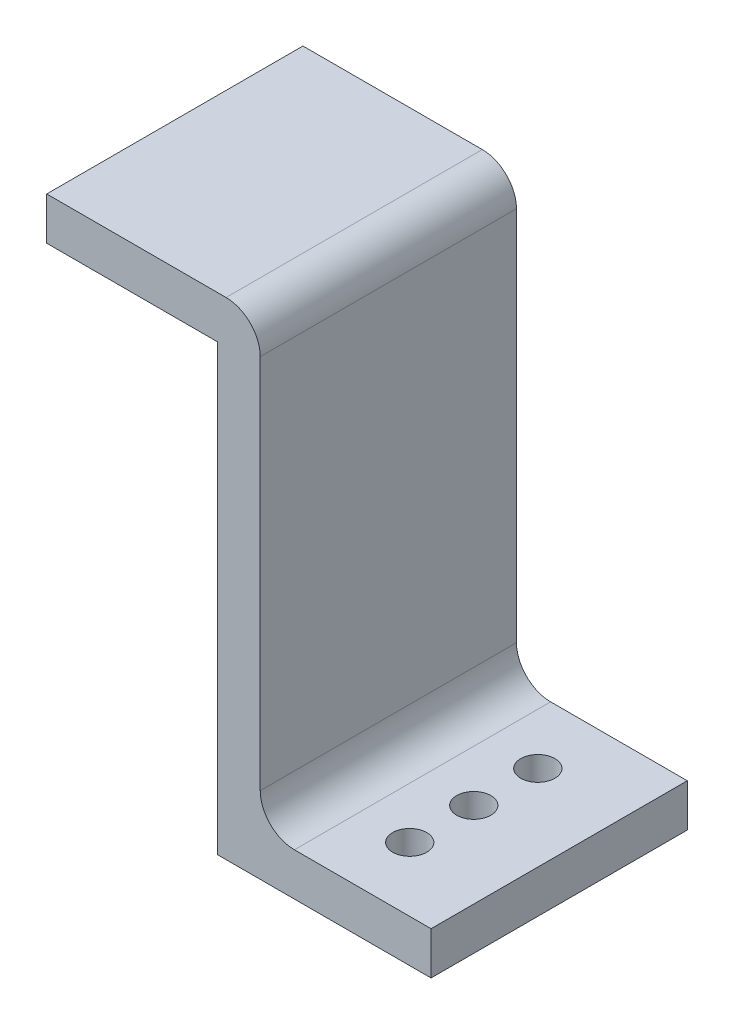
ISO-10303-21;
HEADER;
FILE_DESCRIPTION(('STEP AP214'),'2;1');
FILE_NAME('part.step','',(''),(''),'','','');
FILE_SCHEMA(('AUTOMOTIVE_DESIGN { 1 0 10303 214 1 1 1 1 }'));
ENDSEC;
DATA;
#1=APPLICATION_CONTEXT('core data for automotive mechanical design processes');
#2=APPLICATION_PROTOCOL_DEFINITION('international standard','automotive_design',2000,#1);
#3=PRODUCT_CONTEXT('',#1,'mechanical');
#4=PRODUCT('Part','Part','',(#3));
#5=PRODUCT_RELATED_PRODUCT_CATEGORY('part','',(#4));
#6=PRODUCT_DEFINITION_FORMATION('','',#4);
#7=PRODUCT_DEFINITION_CONTEXT('part definition',#1,'design');
#8=PRODUCT_DEFINITION('design','',#6,#7);
#9=PRODUCT_DEFINITION_SHAPE('','',#8);
#10=(LENGTH_UNIT() NAMED_UNIT(*) SI_UNIT(.MILLI.,.METRE.));
#11=(NAMED_UNIT(*) PLANE_ANGLE_UNIT() SI_UNIT($,.RADIAN.));
#12=(NAMED_UNIT(*) SI_UNIT($,.STERADIAN.) SOLID_ANGLE_UNIT());
#13=UNCERTAINTY_MEASURE_WITH_UNIT(LENGTH_MEASURE(1.E-05),#10,'distance_accuracy_value','');
#14=(GEOMETRIC_REPRESENTATION_CONTEXT(3) GLOBAL_UNCERTAINTY_ASSIGNED_CONTEXT((#13)) GLOBAL_UNIT_ASSIGNED_CONTEXT((#10,
#11,#12)) REPRESENTATION_CONTEXT('',''));
#15=CARTESIAN_POINT('',(0.,0.,0.));
#16=DIRECTION('',(0.,0.,1.));
#17=DIRECTION('',(1.,0.,0.));
#18=AXIS2_PLACEMENT_3D('',#15,#16,#17);
#19=CARTESIAN_POINT('',(0.,23.5,30.));
#20=DIRECTION('',(0.,-1.,0.));
#21=DIRECTION('',(1.,0.,0.));
#22=AXIS2_PLACEMENT_3D('',#19,#20,#21);
#23=PLANE('',#22);
#24=DIRECTION('',(-1.,0.,0.));
#25=VECTOR('',#24,1.);
#26=CARTESIAN_POINT('',(0.,23.5,0.));
#27=LINE('',#26,#25);
#28=CARTESIAN_POINT('',(-2.5,23.5,0.));
#29=VERTEX_POINT('',#28);
#30=CARTESIAN_POINT('',(-22.5,23.5,0.));
#31=VERTEX_POINT('',#30);
#32=EDGE_CURVE('E226',#29,#31,#27,.T.);
#33=ORIENTED_EDGE('',*,*,#32,.F.);
#34=DIRECTION('',(0.,0.,-1.));
#35=VECTOR('',#34,1.);
#36=CARTESIAN_POINT('',(-2.5,23.5,30.));
#37=LINE('',#36,#35);
#38=CARTESIAN_POINT('',(-2.5,23.5,30.));
#39=VERTEX_POINT('',#38);
#40=EDGE_CURVE('E176',#39,#29,#37,.T.);
#41=ORIENTED_EDGE('',*,*,#40,.F.);
#42=DIRECTION('',(-1.,0.,0.));
#43=VECTOR('',#42,1.);
#44=CARTESIAN_POINT('',(0.,23.5,30.));
#45=LINE('',#44,#43);
#46=CARTESIAN_POINT('',(-22.5,23.5,30.));
#47=VERTEX_POINT('',#46);
#48=EDGE_CURVE('E166',#39,#47,#45,.T.);
#49=ORIENTED_EDGE('',*,*,#48,.T.);
#50=DIRECTION('',(0.,0.,-1.));
#51=VECTOR('',#50,1.);
#52=CARTESIAN_POINT('',(-22.5,23.5,30.));
#53=LINE('',#52,#51);
#54=EDGE_CURVE('E164',#47,#31,#53,.T.);
#55=ORIENTED_EDGE('',*,*,#54,.T.);
#56=EDGE_LOOP('',(#33,#41,#49,#55));
#57=FACE_BOUND('',#56,.T.);
#58=ADVANCED_FACE('F67',(#57),#23,.T.);
#59=CARTESIAN_POINT('',(-22.5,0.,30.));
#60=DIRECTION('',(1.,0.,0.));
#61=DIRECTION('',(0.,0.,-1.));
#62=AXIS2_PLACEMENT_3D('',#59,#60,#61);
#63=PLANE('',#62);
#64=DIRECTION('',(0.,-1.,0.));
#65=VECTOR('',#64,1.);
#66=CARTESIAN_POINT('',(-22.5,0.,0.));
#67=LINE('',#66,#65);
#68=CARTESIAN_POINT('',(-22.5,28.5,0.));
#69=VERTEX_POINT('',#68);
#70=EDGE_CURVE('E224',#69,#31,#67,.T.);
#71=ORIENTED_EDGE('',*,*,#70,.T.);
#72=ORIENTED_EDGE('',*,*,#54,.F.);
#73=DIRECTION('',(0.,-1.,0.));
#74=VECTOR('',#73,1.);
#75=CARTESIAN_POINT('',(-22.5,0.,30.));
#76=LINE('',#75,#74);
#77=CARTESIAN_POINT('',(-22.5,28.5,30.));
#78=VERTEX_POINT('',#77);
#79=EDGE_CURVE('E149',#78,#47,#76,.T.);
#80=ORIENTED_EDGE('',*,*,#79,.F.);
#81=DIRECTION('',(0.,0.,-1.));
#82=VECTOR('',#81,1.);
#83=CARTESIAN_POINT('',(-22.5,28.5,30.));
#84=LINE('',#83,#82);
#85=EDGE_CURVE('E163',#78,#69,#84,.T.);
#86=ORIENTED_EDGE('',*,*,#85,.T.);
#87=EDGE_LOOP('',(#71,#72,#80,#86));
#88=FACE_BOUND('',#87,.T.);
#89=ADVANCED_FACE('F162',(#88),#63,.F.);
#90=CARTESIAN_POINT('',(-2.5,0.,30.));
#91=DIRECTION('',(-1.,0.,0.));
#92=DIRECTION('',(0.,-1.,0.));
#93=AXIS2_PLACEMENT_3D('',#90,#91,#92);
#94=PLANE('',#93);
#95=DIRECTION('',(0.,1.,0.));
#96=VECTOR('',#95,1.);
#97=CARTESIAN_POINT('',(-2.5,0.,0.));
#98=LINE('',#97,#96);
#99=CARTESIAN_POINT('',(-2.49999999999999,-28.5,0.));
#100=VERTEX_POINT('',#99);
#101=EDGE_CURVE('E229',#100,#29,#98,.T.);
#102=ORIENTED_EDGE('',*,*,#101,.F.);
#103=DIRECTION('',(0.,0.,-1.));
#104=VECTOR('',#103,1.);
#105=CARTESIAN_POINT('',(-2.49999999999999,-28.5,30.));
#106=LINE('',#105,#104);
#107=CARTESIAN_POINT('',(-2.49999999999999,-28.5,30.));
#108=VERTEX_POINT('',#107);
#109=EDGE_CURVE('E214',#108,#100,#106,.T.);
#110=ORIENTED_EDGE('',*,*,#109,.F.);
#111=DIRECTION('',(0.,1.,0.));
#112=VECTOR('',#111,1.);
#113=CARTESIAN_POINT('',(-2.5,0.,30.));
#114=LINE('',#113,#112);
#115=EDGE_CURVE('E219',#108,#39,#114,.T.);
#116=ORIENTED_EDGE('',*,*,#115,.T.);
#117=ORIENTED_EDGE('',*,*,#40,.T.);
#118=EDGE_LOOP('',(#102,#110,#116,#117));
#119=FACE_BOUND('',#118,.T.);
#120=ADVANCED_FACE('F239',(#119),#94,.T.);
#121=CARTESIAN_POINT('',(0.,28.5,30.));
#122=DIRECTION('',(0.,-1.,0.));
#123=DIRECTION('',(1.,0.,0.));
#124=AXIS2_PLACEMENT_3D('',#121,#122,#123);
#125=PLANE('',#124);
#126=DIRECTION('',(-1.,0.,0.));
#127=VECTOR('',#126,1.);
#128=CARTESIAN_POINT('',(0.,28.5,30.));
#129=LINE('',#128,#127);
#130=CARTESIAN_POINT('',(-1.5,28.5,30.));
#131=VERTEX_POINT('',#130);
#132=EDGE_CURVE('E145',#131,#78,#129,.T.);
#133=ORIENTED_EDGE('',*,*,#132,.F.);
#134=DIRECTION('',(0.,0.,-1.));
#135=VECTOR('',#134,1.);
#136=CARTESIAN_POINT('',(-1.5,28.5,30.));
#137=LINE('',#136,#135);
#138=CARTESIAN_POINT('',(-1.5,28.5,0.));
#139=VERTEX_POINT('',#138);
#140=EDGE_CURVE('E172',#131,#139,#137,.T.);
#141=ORIENTED_EDGE('',*,*,#140,.T.);
#142=DIRECTION('',(-1.,0.,0.));
#143=VECTOR('',#142,1.);
#144=CARTESIAN_POINT('',(0.,28.5,0.));
#145=LINE('',#144,#143);
#146=EDGE_CURVE('E170',#139,#69,#145,.T.);
#147=ORIENTED_EDGE('',*,*,#146,.T.);
#148=ORIENTED_EDGE('',*,*,#85,.F.);
#149=EDGE_LOOP('',(#133,#141,#147,#148));
#150=FACE_BOUND('',#149,.T.);
#151=ADVANCED_FACE('F168',(#150),#125,.F.);
#152=CARTESIAN_POINT('',(0.,0.,0.));
#153=DIRECTION('',(0.,0.,1.));
#154=DIRECTION('',(1.,0.,0.));
#155=AXIS2_PLACEMENT_3D('',#152,#153,#154);
#156=PLANE('',#155);
#157=ORIENTED_EDGE('',*,*,#146,.F.);
#158=CARTESIAN_POINT('',(-1.5,24.5,0.));
#159=DIRECTION('',(0.,0.,1.));
#160=DIRECTION('',(1.,0.,0.));
#161=AXIS2_PLACEMENT_3D('',#158,#159,#160);
#162=CIRCLE('',#161,4.);
#163=CARTESIAN_POINT('',(2.5,24.5,0.));
#164=VERTEX_POINT('',#163);
#165=EDGE_CURVE('E174',#139,#164,#162,.F.);
#166=ORIENTED_EDGE('',*,*,#165,.T.);
#167=DIRECTION('',(0.,1.,0.));
#168=VECTOR('',#167,1.);
#169=CARTESIAN_POINT('',(2.5,0.,0.));
#170=LINE('',#169,#168);
#171=CARTESIAN_POINT('',(2.5,-19.5,0.));
#172=VERTEX_POINT('',#171);
#173=EDGE_CURVE('E157',#172,#164,#170,.T.);
#174=ORIENTED_EDGE('',*,*,#173,.F.);
#175=CARTESIAN_POINT('',(6.5,-19.5,0.));
#176=DIRECTION('',(0.,0.,1.));
#177=DIRECTION('',(1.,0.,0.));
#178=AXIS2_PLACEMENT_3D('',#175,#176,#177);
#179=CIRCLE('',#178,4.);
#180=CARTESIAN_POINT('',(6.5,-23.5,0.));
#181=VERTEX_POINT('',#180);
#182=EDGE_CURVE('E75',#172,#181,#179,.T.);
#183=ORIENTED_EDGE('',*,*,#182,.T.);
#184=DIRECTION('',(1.,0.,0.));
#185=VECTOR('',#184,1.);
#186=CARTESIAN_POINT('',(2.5,-23.5,0.));
#187=LINE('',#186,#185);
#188=CARTESIAN_POINT('',(22.5,-23.5,0.));
#189=VERTEX_POINT('',#188);
#190=EDGE_CURVE('E187',#181,#189,#187,.T.);
#191=ORIENTED_EDGE('',*,*,#190,.T.);
#192=DIRECTION('',(0.,1.,0.));
#193=VECTOR('',#192,1.);
#194=CARTESIAN_POINT('',(22.5,-28.5,0.));
#195=LINE('',#194,#193);
#196=CARTESIAN_POINT('',(22.5,-28.5,0.));
#197=VERTEX_POINT('',#196);
#198=EDGE_CURVE('E183',#197,#189,#195,.T.);
#199=ORIENTED_EDGE('',*,*,#198,.F.);
#200=DIRECTION('',(-1.,0.,0.));
#201=VECTOR('',#200,1.);
#202=CARTESIAN_POINT('',(0.,-28.5,0.));
#203=LINE('',#202,#201);
#204=EDGE_CURVE('E232',#197,#100,#203,.T.);
#205=ORIENTED_EDGE('',*,*,#204,.T.);
#206=ORIENTED_EDGE('',*,*,#101,.T.);
#207=ORIENTED_EDGE('',*,*,#32,.T.);
#208=ORIENTED_EDGE('',*,*,#70,.F.);
#209=EDGE_LOOP('',(#157,#166,#174,#183,#191,#199,#205,#206,#207,#208));
#210=FACE_BOUND('',#209,.T.);
#211=ADVANCED_FACE('F205',(#210),#156,.F.);
#212=CARTESIAN_POINT('',(0.,0.,30.));
#213=DIRECTION('',(0.,0.,1.));
#214=DIRECTION('',(1.,0.,0.));
#215=AXIS2_PLACEMENT_3D('',#212,#213,#214);
#216=PLANE('',#215);
#217=DIRECTION('',(0.,1.,0.));
#218=VECTOR('',#217,1.);
#219=CARTESIAN_POINT('',(2.5,0.,30.));
#220=LINE('',#219,#218);
#221=CARTESIAN_POINT('',(2.5,-19.5,30.));
#222=VERTEX_POINT('',#221);
#223=CARTESIAN_POINT('',(2.5,24.5,30.));
#224=VERTEX_POINT('',#223);
#225=EDGE_CURVE('E212',#222,#224,#220,.T.);
#226=ORIENTED_EDGE('',*,*,#225,.T.);
#227=CARTESIAN_POINT('',(-1.5,24.5,30.));
#228=DIRECTION('',(0.,0.,1.));
#229=DIRECTION('',(1.,0.,0.));
#230=AXIS2_PLACEMENT_3D('',#227,#228,#229);
#231=CIRCLE('',#230,4.);
#232=EDGE_CURVE('E152',#224,#131,#231,.T.);
#233=ORIENTED_EDGE('',*,*,#232,.T.);
#234=ORIENTED_EDGE('',*,*,#132,.T.);
#235=ORIENTED_EDGE('',*,*,#79,.T.);
#236=ORIENTED_EDGE('',*,*,#48,.F.);
#237=ORIENTED_EDGE('',*,*,#115,.F.);
#238=DIRECTION('',(-1.,0.,0.));
#239=VECTOR('',#238,1.);
#240=CARTESIAN_POINT('',(0.,-28.5,30.));
#241=LINE('',#240,#239);
#242=CARTESIAN_POINT('',(22.5,-28.5,30.));
#243=VERTEX_POINT('',#242);
#244=EDGE_CURVE('E215',#243,#108,#241,.T.);
#245=ORIENTED_EDGE('',*,*,#244,.F.);
#246=DIRECTION('',(0.,1.,0.));
#247=VECTOR('',#246,1.);
#248=CARTESIAN_POINT('',(22.5,-28.5,30.));
#249=LINE('',#248,#247);
#250=CARTESIAN_POINT('',(22.5,-23.5,30.));
#251=VERTEX_POINT('',#250);
#252=EDGE_CURVE('E182',#243,#251,#249,.T.);
#253=ORIENTED_EDGE('',*,*,#252,.T.);
#254=DIRECTION('',(1.,0.,0.));
#255=VECTOR('',#254,1.);
#256=CARTESIAN_POINT('',(2.5,-23.5,30.));
#257=LINE('',#256,#255);
#258=CARTESIAN_POINT('',(6.5,-23.5,30.));
#259=VERTEX_POINT('',#258);
#260=EDGE_CURVE('E180',#259,#251,#257,.T.);
#261=ORIENTED_EDGE('',*,*,#260,.F.);
#262=CARTESIAN_POINT('',(6.5,-19.5,30.));
#263=DIRECTION('',(0.,0.,1.));
#264=DIRECTION('',(1.,0.,0.));
#265=AXIS2_PLACEMENT_3D('',#262,#263,#264);
#266=CIRCLE('',#265,4.);
#267=EDGE_CURVE('E12',#259,#222,#266,.F.);
#268=ORIENTED_EDGE('',*,*,#267,.T.);
#269=EDGE_LOOP('',(#226,#233,#234,#235,#236,#237,#245,#253,#261,#268));
#270=FACE_BOUND('',#269,.T.);
#271=ADVANCED_FACE('F147',(#270),#216,.T.);
#272=CARTESIAN_POINT('',(2.5,0.,30.));
#273=DIRECTION('',(-1.,0.,0.));
#274=DIRECTION('',(0.,0.,1.));
#275=AXIS2_PLACEMENT_3D('',#272,#273,#274);
#276=PLANE('',#275);
#277=ORIENTED_EDGE('',*,*,#173,.T.);
#278=DIRECTION('',(0.,0.,-1.));
#279=VECTOR('',#278,1.);
#280=CARTESIAN_POINT('',(2.5,24.5,30.));
#281=LINE('',#280,#279);
#282=EDGE_CURVE('E90',#164,#224,#281,.F.);
#283=ORIENTED_EDGE('',*,*,#282,.T.);
#284=ORIENTED_EDGE('',*,*,#225,.F.);
#285=DIRECTION('',(0.,0.,-1.));
#286=VECTOR('',#285,1.);
#287=CARTESIAN_POINT('',(2.5,-19.5,30.));
#288=LINE('',#287,#286);
#289=EDGE_CURVE('E198',#222,#172,#288,.T.);
#290=ORIENTED_EDGE('',*,*,#289,.T.);
#291=EDGE_LOOP('',(#277,#283,#284,#290));
#292=FACE_BOUND('',#291,.T.);
#293=ADVANCED_FACE('F213',(#292),#276,.F.);
#294=CARTESIAN_POINT('',(0.,-28.5,30.));
#295=DIRECTION('',(0.,-1.,0.));
#296=DIRECTION('',(0.,0.,-1.));
#297=AXIS2_PLACEMENT_3D('',#294,#295,#296);
#298=PLANE('',#297);
#299=CARTESIAN_POINT('',(12.5,-28.5,7.5));
#300=DIRECTION('',(0.,-1.,0.));
#301=DIRECTION('',(0.,0.,-1.));
#302=AXIS2_PLACEMENT_3D('',#299,#300,#301);
#303=CIRCLE('',#302,2.);
#304=CARTESIAN_POINT('',(12.5,-28.5,5.5));
#305=VERTEX_POINT('',#304);
#306=EDGE_CURVE('E189',#305,#305,#303,.T.);
#307=ORIENTED_EDGE('',*,*,#306,.F.);
#308=EDGE_LOOP('',(#307));
#309=FACE_BOUND('',#308,.T.);
#310=CARTESIAN_POINT('',(12.5,-28.5,22.5));
#311=DIRECTION('',(0.,-1.,0.));
#312=DIRECTION('',(0.,0.,-1.));
#313=AXIS2_PLACEMENT_3D('',#310,#311,#312);
#314=CIRCLE('',#313,2.);
#315=CARTESIAN_POINT('',(12.5,-28.5,20.5));
#316=VERTEX_POINT('',#315);
#317=EDGE_CURVE('E252',#316,#316,#314,.T.);
#318=ORIENTED_EDGE('',*,*,#317,.F.);
#319=EDGE_LOOP('',(#318));
#320=FACE_BOUND('',#319,.T.);
#321=CARTESIAN_POINT('',(12.5,-28.5,15.));
#322=DIRECTION('',(0.,-1.,0.));
#323=DIRECTION('',(0.,0.,-1.));
#324=AXIS2_PLACEMENT_3D('',#321,#322,#323);
#325=CIRCLE('',#324,2.);
#326=CARTESIAN_POINT('',(12.5,-28.5,13.));
#327=VERTEX_POINT('',#326);
#328=EDGE_CURVE('E255',#327,#327,#325,.T.);
#329=ORIENTED_EDGE('',*,*,#328,.F.);
#330=EDGE_LOOP('',(#329));
#331=FACE_BOUND('',#330,.T.);
#332=ORIENTED_EDGE('',*,*,#204,.F.);
#333=DIRECTION('',(0.,0.,-1.));
#334=VECTOR('',#333,1.);
#335=CARTESIAN_POINT('',(22.5,-28.5,30.));
#336=LINE('',#335,#334);
#337=EDGE_CURVE('E192',#243,#197,#336,.T.);
#338=ORIENTED_EDGE('',*,*,#337,.F.);
#339=ORIENTED_EDGE('',*,*,#244,.T.);
#340=ORIENTED_EDGE('',*,*,#109,.T.);
#341=EDGE_LOOP('',(#332,#338,#339,#340));
#342=FACE_BOUND('',#341,.T.);
#343=ADVANCED_FACE('F244',(#309,#320,#331,#342),#298,.T.);
#344=CARTESIAN_POINT('',(22.5,-28.5,30.));
#345=DIRECTION('',(-1.,0.,0.));
#346=DIRECTION('',(0.,0.,1.));
#347=AXIS2_PLACEMENT_3D('',#344,#345,#346);
#348=PLANE('',#347);
#349=ORIENTED_EDGE('',*,*,#198,.T.);
#350=DIRECTION('',(0.,0.,-1.));
#351=VECTOR('',#350,1.);
#352=CARTESIAN_POINT('',(22.5,-23.5,30.));
#353=LINE('',#352,#351);
#354=EDGE_CURVE('E186',#251,#189,#353,.T.);
#355=ORIENTED_EDGE('',*,*,#354,.F.);
#356=ORIENTED_EDGE('',*,*,#252,.F.);
#357=ORIENTED_EDGE('',*,*,#337,.T.);
#358=EDGE_LOOP('',(#349,#355,#356,#357));
#359=FACE_BOUND('',#358,.T.);
#360=ADVANCED_FACE('F247',(#359),#348,.F.);
#361=CARTESIAN_POINT('',(2.5,-23.5,30.));
#362=DIRECTION('',(0.,1.,0.));
#363=DIRECTION('',(0.,0.,1.));
#364=AXIS2_PLACEMENT_3D('',#361,#362,#363);
#365=PLANE('',#364);
#366=CARTESIAN_POINT('',(12.5,-23.5,7.5));
#367=DIRECTION('',(0.,1.,0.));
#368=DIRECTION('',(0.,0.,1.));
#369=AXIS2_PLACEMENT_3D('',#366,#367,#368);
#370=CIRCLE('',#369,2.);
#371=CARTESIAN_POINT('',(12.5,-23.5,9.5));
#372=VERTEX_POINT('',#371);
#373=EDGE_CURVE('E262',#372,#372,#370,.T.);
#374=ORIENTED_EDGE('',*,*,#373,.F.);
#375=EDGE_LOOP('',(#374));
#376=FACE_BOUND('',#375,.T.);
#377=CARTESIAN_POINT('',(12.5,-23.5,22.5));
#378=DIRECTION('',(0.,1.,0.));
#379=DIRECTION('',(0.,0.,1.));
#380=AXIS2_PLACEMENT_3D('',#377,#378,#379);
#381=CIRCLE('',#380,2.);
#382=CARTESIAN_POINT('',(12.5,-23.5,24.5));
#383=VERTEX_POINT('',#382);
#384=EDGE_CURVE('E261',#383,#383,#381,.T.);
#385=ORIENTED_EDGE('',*,*,#384,.F.);
#386=EDGE_LOOP('',(#385));
#387=FACE_BOUND('',#386,.T.);
#388=CARTESIAN_POINT('',(12.5,-23.5,15.));
#389=DIRECTION('',(0.,1.,0.));
#390=DIRECTION('',(0.,0.,1.));
#391=AXIS2_PLACEMENT_3D('',#388,#389,#390);
#392=CIRCLE('',#391,2.);
#393=CARTESIAN_POINT('',(12.5,-23.5,17.));
#394=VERTEX_POINT('',#393);
#395=EDGE_CURVE('E258',#394,#394,#392,.T.);
#396=ORIENTED_EDGE('',*,*,#395,.F.);
#397=EDGE_LOOP('',(#396));
#398=FACE_BOUND('',#397,.T.);
#399=ORIENTED_EDGE('',*,*,#190,.F.);
#400=DIRECTION('',(0.,0.,-1.));
#401=VECTOR('',#400,1.);
#402=CARTESIAN_POINT('',(6.5,-23.5,30.));
#403=LINE('',#402,#401);
#404=EDGE_CURVE('E82',#181,#259,#403,.F.);
#405=ORIENTED_EDGE('',*,*,#404,.T.);
#406=ORIENTED_EDGE('',*,*,#260,.T.);
#407=ORIENTED_EDGE('',*,*,#354,.T.);
#408=EDGE_LOOP('',(#399,#405,#406,#407));
#409=FACE_BOUND('',#408,.T.);
#410=ADVANCED_FACE('F209',(#376,#387,#398,#409),#365,.T.);
#411=CARTESIAN_POINT('',(-1.5,24.5,30.));
#412=DIRECTION('',(0.,0.,-1.));
#413=DIRECTION('',(-1.,0.,0.));
#414=AXIS2_PLACEMENT_3D('',#411,#412,#413);
#415=CYLINDRICAL_SURFACE('',#414,4.);
#416=ORIENTED_EDGE('',*,*,#232,.F.);
#417=ORIENTED_EDGE('',*,*,#282,.F.);
#418=ORIENTED_EDGE('',*,*,#165,.F.);
#419=ORIENTED_EDGE('',*,*,#140,.F.);
#420=EDGE_LOOP('',(#416,#417,#418,#419));
#421=FACE_BOUND('',#420,.T.);
#422=ADVANCED_FACE('F272',(#421),#415,.T.);
#423=CARTESIAN_POINT('',(6.5,-19.5,30.));
#424=DIRECTION('',(0.,0.,-1.));
#425=DIRECTION('',(-1.,0.,0.));
#426=AXIS2_PLACEMENT_3D('',#423,#424,#425);
#427=CYLINDRICAL_SURFACE('',#426,4.);
#428=ORIENTED_EDGE('',*,*,#267,.F.);
#429=ORIENTED_EDGE('',*,*,#404,.F.);
#430=ORIENTED_EDGE('',*,*,#182,.F.);
#431=ORIENTED_EDGE('',*,*,#289,.F.);
#432=EDGE_LOOP('',(#428,#429,#430,#431));
#433=FACE_BOUND('',#432,.T.);
#434=ADVANCED_FACE('F69',(#433),#427,.F.);
#435=CARTESIAN_POINT('',(12.5,-53.5,15.));
#436=DIRECTION('',(0.,1.,0.));
#437=DIRECTION('',(0.,0.,1.));
#438=AXIS2_PLACEMENT_3D('',#435,#436,#437);
#439=CYLINDRICAL_SURFACE('',#438,2.);
#440=ORIENTED_EDGE('',*,*,#328,.T.);
#441=EDGE_LOOP('',(#440));
#442=FACE_BOUND('',#441,.T.);
#443=ORIENTED_EDGE('',*,*,#395,.T.);
#444=EDGE_LOOP('',(#443));
#445=FACE_BOUND('',#444,.T.);
#446=ADVANCED_FACE('F277',(#442,#445),#439,.F.);
#447=CARTESIAN_POINT('',(12.5,-53.5,22.5));
#448=DIRECTION('',(0.,1.,0.));
#449=DIRECTION('',(0.,0.,1.));
#450=AXIS2_PLACEMENT_3D('',#447,#448,#449);
#451=CYLINDRICAL_SURFACE('',#450,2.);
#452=ORIENTED_EDGE('',*,*,#317,.T.);
#453=EDGE_LOOP('',(#452));
#454=FACE_BOUND('',#453,.T.);
#455=ORIENTED_EDGE('',*,*,#384,.T.);
#456=EDGE_LOOP('',(#455));
#457=FACE_BOUND('',#456,.T.);
#458=ADVANCED_FACE('F268',(#454,#457),#451,.F.);
#459=CARTESIAN_POINT('',(12.5,-53.5,7.5));
#460=DIRECTION('',(0.,1.,0.));
#461=DIRECTION('',(0.,0.,1.));
#462=AXIS2_PLACEMENT_3D('',#459,#460,#461);
#463=CYLINDRICAL_SURFACE('',#462,2.);
#464=ORIENTED_EDGE('',*,*,#306,.T.);
#465=EDGE_LOOP('',(#464));
#466=FACE_BOUND('',#465,.T.);
#467=ORIENTED_EDGE('',*,*,#373,.T.);
#468=EDGE_LOOP('',(#467));
#469=FACE_BOUND('',#468,.T.);
#470=ADVANCED_FACE('F285',(#466,#469),#463,.F.);
#471=CLOSED_SHELL('',(#58,#89,#120,#151,#211,#271,#293,#343,#360,#410,#422,#434,#446,#458,#470));
#472=MANIFOLD_SOLID_BREP('B2',#471);
#473=ADVANCED_BREP_SHAPE_REPRESENTATION('',(#18,#472),#14);
#474=SHAPE_DEFINITION_REPRESENTATION(#9,#473);
ENDSEC;
END-ISO-10303-21;
